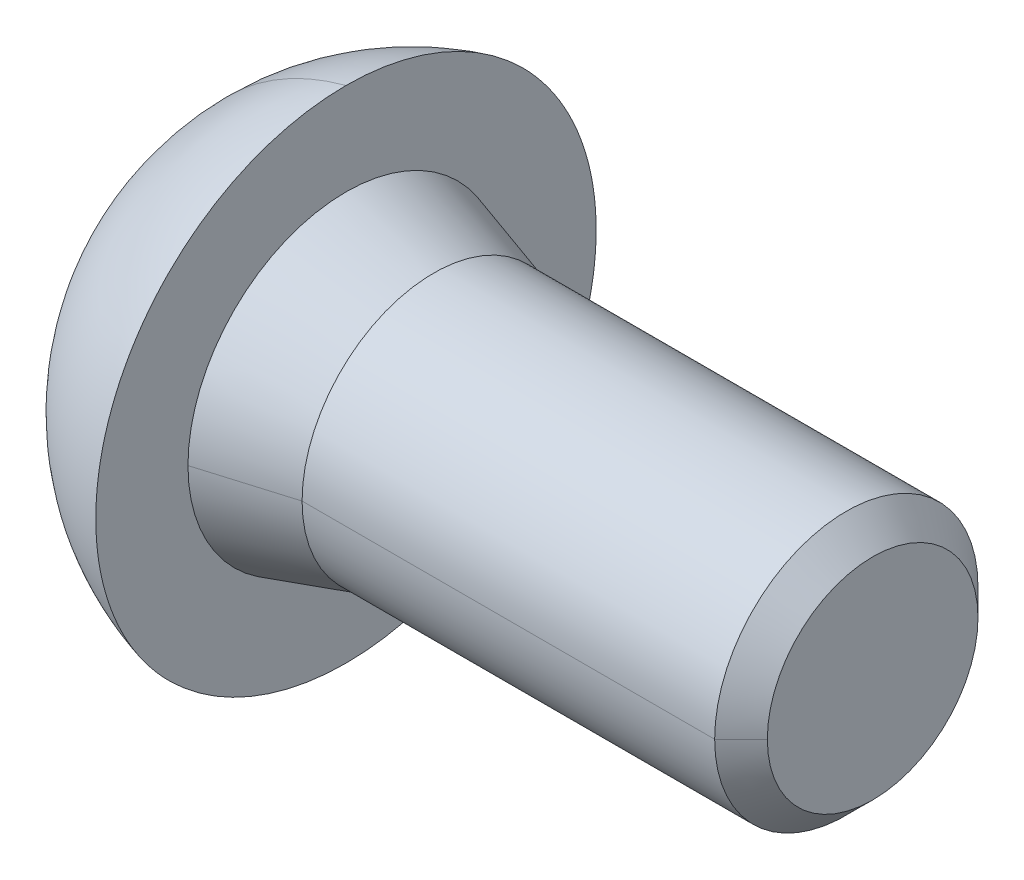
ISO-10303-21;
HEADER;
FILE_DESCRIPTION(('STEP AP214'),'2;1');
FILE_NAME('part.step','',(''),(''),'','','');
FILE_SCHEMA(('AUTOMOTIVE_DESIGN { 1 0 10303 214 1 1 1 1 }'));
ENDSEC;
DATA;
#1=APPLICATION_CONTEXT('core data for automotive mechanical design processes');
#2=APPLICATION_PROTOCOL_DEFINITION('international standard','automotive_design',2000,#1);
#3=PRODUCT_CONTEXT('',#1,'mechanical');
#4=PRODUCT('Part','Part','',(#3));
#5=PRODUCT_RELATED_PRODUCT_CATEGORY('part','',(#4));
#6=PRODUCT_DEFINITION_FORMATION('','',#4);
#7=PRODUCT_DEFINITION_CONTEXT('part definition',#1,'design');
#8=PRODUCT_DEFINITION('design','',#6,#7);
#9=PRODUCT_DEFINITION_SHAPE('','',#8);
#10=(LENGTH_UNIT() NAMED_UNIT(*) SI_UNIT(.MILLI.,.METRE.));
#11=(NAMED_UNIT(*) PLANE_ANGLE_UNIT() SI_UNIT($,.RADIAN.));
#12=(NAMED_UNIT(*) SI_UNIT($,.STERADIAN.) SOLID_ANGLE_UNIT());
#13=UNCERTAINTY_MEASURE_WITH_UNIT(LENGTH_MEASURE(1.E-05),#10,'distance_accuracy_value','');
#14=(GEOMETRIC_REPRESENTATION_CONTEXT(3) GLOBAL_UNCERTAINTY_ASSIGNED_CONTEXT((#13)) GLOBAL_UNIT_ASSIGNED_CONTEXT((#10,
#11,#12)) REPRESENTATION_CONTEXT('',''));
#15=CARTESIAN_POINT('',(0.,0.,0.));
#16=DIRECTION('',(0.,0.,1.));
#17=DIRECTION('',(1.,0.,0.));
#18=AXIS2_PLACEMENT_3D('',#15,#16,#17);
#19=CARTESIAN_POINT('',(-6.18082356026828,1.10400473277223,-0.637397429652666));
#20=DIRECTION('',(-0.979385865114737,0.174935689354957,-0.100999167339957));
#21=DIRECTION('',(-0.10258098021448,0.,0.994724656625258));
#22=AXIS2_PLACEMENT_3D('',#19,#20,#21);
#23=PLANE('',#22);
#24=DIRECTION('',(-0.175834818906266,-0.492209842562144,0.852532455303111));
#25=VECTOR('',#24,1.);
#26=CARTESIAN_POINT('',(-6.44375,0.,0.));
#27=LINE('',#26,#25);
#28=CARTESIAN_POINT('',(-6.44375,0.,0.));
#29=VERTEX_POINT('',#28);
#30=CARTESIAN_POINT('',(-6.65,-0.577350269189626,1.));
#31=VERTEX_POINT('',#30);
#32=EDGE_CURVE('E139',#29,#31,#27,.T.);
#33=ORIENTED_EDGE('',*,*,#32,.F.);
#34=DIRECTION('',(-0.175834818906266,-0.984419685124287,0.));
#35=VECTOR('',#34,1.);
#36=CARTESIAN_POINT('',(-6.44375,0.,0.));
#37=LINE('',#36,#35);
#38=CARTESIAN_POINT('',(-6.65,-1.15470053837925,0.));
#39=VERTEX_POINT('',#38);
#40=EDGE_CURVE('E10',#29,#39,#37,.T.);
#41=ORIENTED_EDGE('',*,*,#40,.T.);
#42=DIRECTION('',(0.,0.5,0.866025403784438));
#43=VECTOR('',#42,1.);
#44=CARTESIAN_POINT('',(-6.65,-0.577350269189626,1.));
#45=LINE('',#44,#43);
#46=EDGE_CURVE('E255',#39,#31,#45,.T.);
#47=ORIENTED_EDGE('',*,*,#46,.T.);
#48=EDGE_LOOP('',(#33,#41,#47));
#49=FACE_BOUND('',#48,.T.);
#50=ADVANCED_FACE('F16',(#49),#23,.T.);
#51=CARTESIAN_POINT('',(-6.18082356026828,1.10400473277223,0.637397429652665));
#52=DIRECTION('',(-0.979385865114737,0.174935689354957,0.100999167339957));
#53=DIRECTION('',(0.102580980214479,0.,0.994724656625258));
#54=AXIS2_PLACEMENT_3D('',#51,#52,#53);
#55=PLANE('',#54);
#56=ORIENTED_EDGE('',*,*,#40,.F.);
#57=DIRECTION('',(-0.175834818906266,-0.492209842562142,-0.852532455303112));
#58=VECTOR('',#57,1.);
#59=CARTESIAN_POINT('',(-6.44375,0.,0.));
#60=LINE('',#59,#58);
#61=CARTESIAN_POINT('',(-6.65,-0.577350269189625,-1.));
#62=VERTEX_POINT('',#61);
#63=EDGE_CURVE('E20',#29,#62,#60,.T.);
#64=ORIENTED_EDGE('',*,*,#63,.T.);
#65=DIRECTION('',(0.,-0.5,0.866025403784439));
#66=VECTOR('',#65,1.);
#67=CARTESIAN_POINT('',(-6.65,-1.15470053837925,0.));
#68=LINE('',#67,#66);
#69=EDGE_CURVE('E190',#62,#39,#68,.T.);
#70=ORIENTED_EDGE('',*,*,#69,.T.);
#71=EDGE_LOOP('',(#56,#64,#70));
#72=FACE_BOUND('',#71,.T.);
#73=ADVANCED_FACE('F337',(#72),#55,.T.);
#74=CARTESIAN_POINT('',(-6.18082356026828,0.,1.27479485930533));
#75=DIRECTION('',(-0.979385865114737,0.,0.201998334679914));
#76=DIRECTION('',(0.,1.,0.));
#77=AXIS2_PLACEMENT_3D('',#74,#75,#76);
#78=PLANE('',#77);
#79=ORIENTED_EDGE('',*,*,#63,.F.);
#80=DIRECTION('',(-0.175834818906266,0.492209842562143,-0.852532455303111));
#81=VECTOR('',#80,1.);
#82=CARTESIAN_POINT('',(-6.44375,0.,0.));
#83=LINE('',#82,#81);
#84=CARTESIAN_POINT('',(-6.65,0.577350269189626,-1.));
#85=VERTEX_POINT('',#84);
#86=EDGE_CURVE('E210',#29,#85,#83,.T.);
#87=ORIENTED_EDGE('',*,*,#86,.T.);
#88=DIRECTION('',(0.,-1.,0.));
#89=VECTOR('',#88,1.);
#90=CARTESIAN_POINT('',(-6.65,0.,-1.));
#91=LINE('',#90,#89);
#92=EDGE_CURVE('E189',#85,#62,#91,.T.);
#93=ORIENTED_EDGE('',*,*,#92,.T.);
#94=EDGE_LOOP('',(#79,#87,#93));
#95=FACE_BOUND('',#94,.T.);
#96=ADVANCED_FACE('F342',(#95),#78,.T.);
#97=CARTESIAN_POINT('',(-6.18082356026828,-1.10400473277222,0.637397429652666));
#98=DIRECTION('',(-0.979385865114737,-0.174935689354957,0.100999167339957));
#99=DIRECTION('',(-0.175834818906266,0.984419685124287,0.));
#100=AXIS2_PLACEMENT_3D('',#97,#98,#99);
#101=PLANE('',#100);
#102=ORIENTED_EDGE('',*,*,#86,.F.);
#103=DIRECTION('',(-0.175834818906266,0.984419685124287,0.));
#104=VECTOR('',#103,1.);
#105=CARTESIAN_POINT('',(-6.44375,0.,0.));
#106=LINE('',#105,#104);
#107=CARTESIAN_POINT('',(-6.65,1.15470053837925,0.));
#108=VERTEX_POINT('',#107);
#109=EDGE_CURVE('E140',#29,#108,#106,.T.);
#110=ORIENTED_EDGE('',*,*,#109,.T.);
#111=DIRECTION('',(0.,-0.5,-0.866025403784438));
#112=VECTOR('',#111,1.);
#113=CARTESIAN_POINT('',(-6.65,0.577350269189626,-1.));
#114=LINE('',#113,#112);
#115=EDGE_CURVE('E134',#108,#85,#114,.T.);
#116=ORIENTED_EDGE('',*,*,#115,.T.);
#117=EDGE_LOOP('',(#102,#110,#116));
#118=FACE_BOUND('',#117,.T.);
#119=ADVANCED_FACE('F368',(#118),#101,.T.);
#120=CARTESIAN_POINT('',(-6.18082356026828,0.,-1.27479485930533));
#121=DIRECTION('',(-0.979385865114737,0.,-0.201998334679914));
#122=DIRECTION('',(-0.201998334679914,0.,0.979385865114737));
#123=AXIS2_PLACEMENT_3D('',#120,#121,#122);
#124=PLANE('',#123);
#125=DIRECTION('',(-0.175834818906266,0.492209842562145,0.85253245530311));
#126=VECTOR('',#125,1.);
#127=CARTESIAN_POINT('',(-6.44375,0.,0.));
#128=LINE('',#127,#126);
#129=CARTESIAN_POINT('',(-6.65,0.577350269189627,1.));
#130=VERTEX_POINT('',#129);
#131=EDGE_CURVE('E136',#29,#130,#128,.T.);
#132=ORIENTED_EDGE('',*,*,#131,.F.);
#133=ORIENTED_EDGE('',*,*,#32,.T.);
#134=DIRECTION('',(0.,1.,0.));
#135=VECTOR('',#134,1.);
#136=CARTESIAN_POINT('',(-6.65,0.,1.));
#137=LINE('',#136,#135);
#138=EDGE_CURVE('E179',#31,#130,#137,.T.);
#139=ORIENTED_EDGE('',*,*,#138,.T.);
#140=EDGE_LOOP('',(#132,#133,#139));
#141=FACE_BOUND('',#140,.T.);
#142=ADVANCED_FACE('F247',(#141),#124,.T.);
#143=CARTESIAN_POINT('',(-6.18082356026828,-1.10400473277223,-0.637397429652665));
#144=DIRECTION('',(-0.979385865114737,-0.174935689354957,-0.100999167339957));
#145=DIRECTION('',(-0.175834818906266,0.984419685124287,0.));
#146=AXIS2_PLACEMENT_3D('',#143,#144,#145);
#147=PLANE('',#146);
#148=ORIENTED_EDGE('',*,*,#109,.F.);
#149=ORIENTED_EDGE('',*,*,#131,.T.);
#150=DIRECTION('',(0.,0.5,-0.866025403784439));
#151=VECTOR('',#150,1.);
#152=CARTESIAN_POINT('',(-6.65,1.15470053837925,0.));
#153=LINE('',#152,#151);
#154=EDGE_CURVE('E171',#130,#108,#153,.T.);
#155=ORIENTED_EDGE('',*,*,#154,.T.);
#156=EDGE_LOOP('',(#148,#149,#155));
#157=FACE_BOUND('',#156,.T.);
#158=ADVANCED_FACE('F275',(#157),#147,.T.);
#159=CARTESIAN_POINT('',(0.,0.,0.));
#160=DIRECTION('',(-1.,0.,0.));
#161=DIRECTION('',(0.,0.,1.));
#162=AXIS2_PLACEMENT_3D('',#159,#160,#161);
#163=CONICAL_SURFACE('',#162,1.2,0.785398163397445);
#164=DIRECTION('',(-0.70710678118655,0.,-0.707106781186545));
#165=VECTOR('',#164,1.);
#166=CARTESIAN_POINT('',(0.,0.,-1.2));
#167=LINE('',#166,#165);
#168=CARTESIAN_POINT('',(0.,0.,-1.2));
#169=VERTEX_POINT('',#168);
#170=CARTESIAN_POINT('',(-0.3,0.,-1.5));
#171=VERTEX_POINT('',#170);
#172=EDGE_CURVE('E116',#169,#171,#167,.T.);
#173=ORIENTED_EDGE('',*,*,#172,.F.);
#174=CARTESIAN_POINT('',(0.,0.,0.));
#175=DIRECTION('',(1.,0.,0.));
#176=DIRECTION('',(0.,0.,-1.));
#177=AXIS2_PLACEMENT_3D('',#174,#175,#176);
#178=CIRCLE('',#177,1.2);
#179=CARTESIAN_POINT('',(0.,0.,1.2));
#180=VERTEX_POINT('',#179);
#181=EDGE_CURVE('E103',#180,#169,#178,.T.);
#182=ORIENTED_EDGE('',*,*,#181,.F.);
#183=DIRECTION('',(-0.70710678118655,0.,0.707106781186545));
#184=VECTOR('',#183,1.);
#185=CARTESIAN_POINT('',(0.,0.,1.2));
#186=LINE('',#185,#184);
#187=CARTESIAN_POINT('',(-0.3,0.,1.5));
#188=VERTEX_POINT('',#187);
#189=EDGE_CURVE('E126',#180,#188,#186,.T.);
#190=ORIENTED_EDGE('',*,*,#189,.T.);
#191=CARTESIAN_POINT('',(-0.3,0.,0.));
#192=DIRECTION('',(-1.,0.,0.));
#193=DIRECTION('',(0.,0.,-1.));
#194=AXIS2_PLACEMENT_3D('',#191,#192,#193);
#195=CIRCLE('',#194,1.5);
#196=EDGE_CURVE('E118',#171,#188,#195,.T.);
#197=ORIENTED_EDGE('',*,*,#196,.F.);
#198=EDGE_LOOP('',(#173,#182,#190,#197));
#199=FACE_BOUND('',#198,.T.);
#200=ADVANCED_FACE('F18',(#199),#163,.T.);
#201=CARTESIAN_POINT('',(-6.65,1.15470053837925,0.));
#202=DIRECTION('',(0.,0.866025403784439,-0.5));
#203=DIRECTION('',(-1.,0.,0.));
#204=AXIS2_PLACEMENT_3D('',#201,#202,#203);
#205=PLANE('',#204);
#206=DIRECTION('',(0.,-0.5,-0.866025403784439));
#207=VECTOR('',#206,1.);
#208=CARTESIAN_POINT('',(-7.65,1.15470053837925,0.));
#209=LINE('',#208,#207);
#210=CARTESIAN_POINT('',(-7.65,1.15470053837925,0.));
#211=VERTEX_POINT('',#210);
#212=CARTESIAN_POINT('',(-7.65,0.577350269189626,-1.));
#213=VERTEX_POINT('',#212);
#214=EDGE_CURVE('E157',#211,#213,#209,.T.);
#215=ORIENTED_EDGE('',*,*,#214,.T.);
#216=DIRECTION('',(-1.,0.,0.));
#217=VECTOR('',#216,1.);
#218=CARTESIAN_POINT('',(-6.65,0.577350269189626,-1.));
#219=LINE('',#218,#217);
#220=EDGE_CURVE('E232',#85,#213,#219,.T.);
#221=ORIENTED_EDGE('',*,*,#220,.F.);
#222=ORIENTED_EDGE('',*,*,#115,.F.);
#223=DIRECTION('',(-1.,0.,0.));
#224=VECTOR('',#223,1.);
#225=CARTESIAN_POINT('',(-6.65,1.15470053837925,0.));
#226=LINE('',#225,#224);
#227=EDGE_CURVE('E176',#108,#211,#226,.T.);
#228=ORIENTED_EDGE('',*,*,#227,.T.);
#229=EDGE_LOOP('',(#215,#221,#222,#228));
#230=FACE_BOUND('',#229,.T.);
#231=ADVANCED_FACE('F354',(#230),#205,.F.);
#232=CARTESIAN_POINT('',(-6.65,0.577350269189626,-1.));
#233=DIRECTION('',(0.,0.,-1.));
#234=DIRECTION('',(0.,-1.,0.));
#235=AXIS2_PLACEMENT_3D('',#232,#233,#234);
#236=PLANE('',#235);
#237=DIRECTION('',(0.,-1.,0.));
#238=VECTOR('',#237,1.);
#239=CARTESIAN_POINT('',(-7.65,0.577350269189626,-1.));
#240=LINE('',#239,#238);
#241=CARTESIAN_POINT('',(-7.65,-0.577350269189627,-1.));
#242=VERTEX_POINT('',#241);
#243=EDGE_CURVE('E153',#213,#242,#240,.T.);
#244=ORIENTED_EDGE('',*,*,#243,.T.);
#245=DIRECTION('',(-1.,0.,0.));
#246=VECTOR('',#245,1.);
#247=CARTESIAN_POINT('',(-6.65,-0.577350269189627,-1.));
#248=LINE('',#247,#246);
#249=EDGE_CURVE('E185',#62,#242,#248,.T.);
#250=ORIENTED_EDGE('',*,*,#249,.F.);
#251=ORIENTED_EDGE('',*,*,#92,.F.);
#252=ORIENTED_EDGE('',*,*,#220,.T.);
#253=EDGE_LOOP('',(#244,#250,#251,#252));
#254=FACE_BOUND('',#253,.T.);
#255=ADVANCED_FACE('F350',(#254),#236,.F.);
#256=CARTESIAN_POINT('',(-6.65,-0.577350269189627,-1.));
#257=DIRECTION('',(0.,-0.866025403784439,-0.5));
#258=DIRECTION('',(0.,0.5,-0.866025403784439));
#259=AXIS2_PLACEMENT_3D('',#256,#257,#258);
#260=PLANE('',#259);
#261=DIRECTION('',(0.,-0.5,0.866025403784439));
#262=VECTOR('',#261,1.);
#263=CARTESIAN_POINT('',(-7.65,-0.577350269189627,-1.));
#264=LINE('',#263,#262);
#265=CARTESIAN_POINT('',(-7.65,-1.15470053837925,0.));
#266=VERTEX_POINT('',#265);
#267=EDGE_CURVE('E158',#242,#266,#264,.T.);
#268=ORIENTED_EDGE('',*,*,#267,.T.);
#269=DIRECTION('',(-1.,0.,0.));
#270=VECTOR('',#269,1.);
#271=CARTESIAN_POINT('',(-6.65,-1.15470053837925,0.));
#272=LINE('',#271,#270);
#273=EDGE_CURVE('E224',#39,#266,#272,.T.);
#274=ORIENTED_EDGE('',*,*,#273,.F.);
#275=ORIENTED_EDGE('',*,*,#69,.F.);
#276=ORIENTED_EDGE('',*,*,#249,.T.);
#277=EDGE_LOOP('',(#268,#274,#275,#276));
#278=FACE_BOUND('',#277,.T.);
#279=ADVANCED_FACE('F353',(#278),#260,.F.);
#280=CARTESIAN_POINT('',(-6.65,-1.15470053837925,0.));
#281=DIRECTION('',(0.,-0.866025403784439,0.5));
#282=DIRECTION('',(-1.,0.,0.));
#283=AXIS2_PLACEMENT_3D('',#280,#281,#282);
#284=PLANE('',#283);
#285=DIRECTION('',(0.,0.5,0.866025403784439));
#286=VECTOR('',#285,1.);
#287=CARTESIAN_POINT('',(-7.65,-1.15470053837925,0.));
#288=LINE('',#287,#286);
#289=CARTESIAN_POINT('',(-7.65,-0.577350269189627,1.));
#290=VERTEX_POINT('',#289);
#291=EDGE_CURVE('E145',#266,#290,#288,.T.);
#292=ORIENTED_EDGE('',*,*,#291,.T.);
#293=DIRECTION('',(-1.,0.,0.));
#294=VECTOR('',#293,1.);
#295=CARTESIAN_POINT('',(-6.65,-0.577350269189627,1.));
#296=LINE('',#295,#294);
#297=EDGE_CURVE('E206',#31,#290,#296,.T.);
#298=ORIENTED_EDGE('',*,*,#297,.F.);
#299=ORIENTED_EDGE('',*,*,#46,.F.);
#300=ORIENTED_EDGE('',*,*,#273,.T.);
#301=EDGE_LOOP('',(#292,#298,#299,#300));
#302=FACE_BOUND('',#301,.T.);
#303=ADVANCED_FACE('F261',(#302),#284,.F.);
#304=CARTESIAN_POINT('',(-6.65,-0.577350269189627,1.));
#305=DIRECTION('',(0.,0.,1.));
#306=DIRECTION('',(0.,-1.,0.));
#307=AXIS2_PLACEMENT_3D('',#304,#305,#306);
#308=PLANE('',#307);
#309=DIRECTION('',(0.,1.,0.));
#310=VECTOR('',#309,1.);
#311=CARTESIAN_POINT('',(-7.65,-0.577350269189627,1.));
#312=LINE('',#311,#310);
#313=CARTESIAN_POINT('',(-7.65,0.577350269189627,1.));
#314=VERTEX_POINT('',#313);
#315=EDGE_CURVE('E141',#290,#314,#312,.T.);
#316=ORIENTED_EDGE('',*,*,#315,.T.);
#317=DIRECTION('',(-1.,0.,0.));
#318=VECTOR('',#317,1.);
#319=CARTESIAN_POINT('',(-6.65,0.577350269189627,1.));
#320=LINE('',#319,#318);
#321=EDGE_CURVE('E175',#130,#314,#320,.T.);
#322=ORIENTED_EDGE('',*,*,#321,.F.);
#323=ORIENTED_EDGE('',*,*,#138,.F.);
#324=ORIENTED_EDGE('',*,*,#297,.T.);
#325=EDGE_LOOP('',(#316,#322,#323,#324));
#326=FACE_BOUND('',#325,.T.);
#327=ADVANCED_FACE('F267',(#326),#308,.F.);
#328=CARTESIAN_POINT('',(-6.65,0.577350269189627,1.));
#329=DIRECTION('',(0.,0.866025403784439,0.5));
#330=DIRECTION('',(1.,0.,0.));
#331=AXIS2_PLACEMENT_3D('',#328,#329,#330);
#332=PLANE('',#331);
#333=DIRECTION('',(0.,0.5,-0.866025403784439));
#334=VECTOR('',#333,1.);
#335=CARTESIAN_POINT('',(-7.65,0.577350269189627,1.));
#336=LINE('',#335,#334);
#337=EDGE_CURVE('E146',#314,#211,#336,.T.);
#338=ORIENTED_EDGE('',*,*,#337,.T.);
#339=ORIENTED_EDGE('',*,*,#227,.F.);
#340=ORIENTED_EDGE('',*,*,#154,.F.);
#341=ORIENTED_EDGE('',*,*,#321,.T.);
#342=EDGE_LOOP('',(#338,#339,#340,#341));
#343=FACE_BOUND('',#342,.T.);
#344=ADVANCED_FACE('F273',(#343),#332,.F.);
#345=CARTESIAN_POINT('',(-7.65,1.71,0.));
#346=DIRECTION('',(-1.,0.,0.));
#347=DIRECTION('',(0.,0.,1.));
#348=AXIS2_PLACEMENT_3D('',#345,#346,#347);
#349=PLANE('',#348);
#350=ORIENTED_EDGE('',*,*,#337,.F.);
#351=ORIENTED_EDGE('',*,*,#315,.F.);
#352=ORIENTED_EDGE('',*,*,#291,.F.);
#353=ORIENTED_EDGE('',*,*,#267,.F.);
#354=ORIENTED_EDGE('',*,*,#243,.F.);
#355=ORIENTED_EDGE('',*,*,#214,.F.);
#356=EDGE_LOOP('',(#350,#351,#352,#353,#354,#355));
#357=FACE_BOUND('',#356,.T.);
#358=CARTESIAN_POINT('',(-7.65,0.,0.));
#359=DIRECTION('',(1.,0.,0.));
#360=DIRECTION('',(0.,0.,-1.));
#361=AXIS2_PLACEMENT_3D('',#358,#359,#360);
#362=CIRCLE('',#361,1.71);
#363=CARTESIAN_POINT('',(-7.65,1.71,0.));
#364=VERTEX_POINT('',#363);
#365=CARTESIAN_POINT('',(-7.65,-1.71,0.));
#366=VERTEX_POINT('',#365);
#367=EDGE_CURVE('E170',#364,#366,#362,.T.);
#368=ORIENTED_EDGE('',*,*,#367,.F.);
#369=CARTESIAN_POINT('',(-7.65,0.,0.));
#370=DIRECTION('',(1.,0.,0.));
#371=DIRECTION('',(0.,0.,-1.));
#372=AXIS2_PLACEMENT_3D('',#369,#370,#371);
#373=CIRCLE('',#372,1.71);
#374=EDGE_CURVE('E151',#366,#364,#373,.T.);
#375=ORIENTED_EDGE('',*,*,#374,.F.);
#376=EDGE_LOOP('',(#368,#375));
#377=FACE_BOUND('',#376,.T.);
#378=ADVANCED_FACE('F346',(#357,#377),#349,.T.);
#379=CARTESIAN_POINT('',(-5.24972727272728,0.,0.));
#380=DIRECTION('',(0.,0.,1.));
#381=DIRECTION('',(0.,1.,0.));
#382=AXIS2_PLACEMENT_3D('',#379,#380,#381);
#383=SPHERICAL_SURFACE('',#382,2.94710182472361);
#384=CARTESIAN_POINT('',(-5.24972727272728,0.,0.));
#385=DIRECTION('',(0.,0.,1.));
#386=DIRECTION('',(0.,-1.,0.));
#387=AXIS2_PLACEMENT_3D('',#384,#385,#386);
#388=CIRCLE('',#387,2.94710182472361);
#389=CARTESIAN_POINT('',(-6.,-2.85,0.));
#390=VERTEX_POINT('',#389);
#391=EDGE_CURVE('E180',#366,#390,#388,.T.);
#392=ORIENTED_EDGE('',*,*,#391,.F.);
#393=ORIENTED_EDGE('',*,*,#374,.T.);
#394=CARTESIAN_POINT('',(-5.24972727272728,0.,0.));
#395=DIRECTION('',(0.,0.,-1.));
#396=DIRECTION('',(-1.,0.,0.));
#397=AXIS2_PLACEMENT_3D('',#394,#395,#396);
#398=CIRCLE('',#397,2.94710182472361);
#399=CARTESIAN_POINT('',(-6.,2.85,0.));
#400=VERTEX_POINT('',#399);
#401=EDGE_CURVE('E167',#364,#400,#398,.T.);
#402=ORIENTED_EDGE('',*,*,#401,.T.);
#403=CARTESIAN_POINT('',(-6.,0.,0.));
#404=DIRECTION('',(1.,0.,0.));
#405=DIRECTION('',(0.,0.,-1.));
#406=AXIS2_PLACEMENT_3D('',#403,#404,#405);
#407=CIRCLE('',#406,2.85);
#408=EDGE_CURVE('E147',#390,#400,#407,.T.);
#409=ORIENTED_EDGE('',*,*,#408,.F.);
#410=EDGE_LOOP('',(#392,#393,#402,#409));
#411=FACE_BOUND('',#410,.T.);
#412=ADVANCED_FACE('F359',(#411),#383,.T.);
#413=CARTESIAN_POINT('',(-6.,1.8,0.));
#414=DIRECTION('',(1.,0.,0.));
#415=DIRECTION('',(0.,1.,0.));
#416=AXIS2_PLACEMENT_3D('',#413,#414,#415);
#417=PLANE('',#416);
#418=CARTESIAN_POINT('',(-6.,0.,0.));
#419=DIRECTION('',(1.,0.,0.));
#420=DIRECTION('',(0.,0.,-1.));
#421=AXIS2_PLACEMENT_3D('',#418,#419,#420);
#422=CIRCLE('',#421,1.8);
#423=CARTESIAN_POINT('',(-6.,0.,1.8));
#424=VERTEX_POINT('',#423);
#425=CARTESIAN_POINT('',(-6.,0.,-1.8));
#426=VERTEX_POINT('',#425);
#427=EDGE_CURVE('E152',#424,#426,#422,.T.);
#428=ORIENTED_EDGE('',*,*,#427,.F.);
#429=CARTESIAN_POINT('',(-6.,0.,0.));
#430=DIRECTION('',(1.,0.,0.));
#431=DIRECTION('',(0.,0.,-1.));
#432=AXIS2_PLACEMENT_3D('',#429,#430,#431);
#433=CIRCLE('',#432,1.8);
#434=EDGE_CURVE('E199',#426,#424,#433,.T.);
#435=ORIENTED_EDGE('',*,*,#434,.F.);
#436=EDGE_LOOP('',(#428,#435));
#437=FACE_BOUND('',#436,.T.);
#438=CARTESIAN_POINT('',(-6.,0.,0.));
#439=DIRECTION('',(1.,0.,0.));
#440=DIRECTION('',(0.,0.,-1.));
#441=AXIS2_PLACEMENT_3D('',#438,#439,#440);
#442=CIRCLE('',#441,2.85);
#443=EDGE_CURVE('E184',#400,#390,#442,.T.);
#444=ORIENTED_EDGE('',*,*,#443,.T.);
#445=ORIENTED_EDGE('',*,*,#408,.T.);
#446=EDGE_LOOP('',(#444,#445));
#447=FACE_BOUND('',#446,.T.);
#448=ADVANCED_FACE('F356',(#437,#447),#417,.T.);
#449=CARTESIAN_POINT('',(-5.,0.,0.));
#450=DIRECTION('',(-1.,0.,0.));
#451=DIRECTION('',(0.,0.,1.));
#452=AXIS2_PLACEMENT_3D('',#449,#450,#451);
#453=CONICAL_SURFACE('',#452,1.5,0.291456794477868);
#454=DIRECTION('',(-0.957826285221151,0.,-0.287347885566346));
#455=VECTOR('',#454,1.);
#456=CARTESIAN_POINT('',(-5.,0.,-1.5));
#457=LINE('',#456,#455);
#458=CARTESIAN_POINT('',(-5.,0.,-1.5));
#459=VERTEX_POINT('',#458);
#460=EDGE_CURVE('E166',#459,#426,#457,.T.);
#461=ORIENTED_EDGE('',*,*,#460,.F.);
#462=CARTESIAN_POINT('',(-5.,0.,0.));
#463=DIRECTION('',(1.,0.,0.));
#464=DIRECTION('',(0.,0.,-1.));
#465=AXIS2_PLACEMENT_3D('',#462,#463,#464);
#466=CIRCLE('',#465,1.5);
#467=CARTESIAN_POINT('',(-5.,0.,1.5));
#468=VERTEX_POINT('',#467);
#469=EDGE_CURVE('E112',#468,#459,#466,.T.);
#470=ORIENTED_EDGE('',*,*,#469,.F.);
#471=DIRECTION('',(-0.957826285221151,0.,0.287347885566346));
#472=VECTOR('',#471,1.);
#473=CARTESIAN_POINT('',(-5.,0.,1.5));
#474=LINE('',#473,#472);
#475=EDGE_CURVE('E194',#468,#424,#474,.T.);
#476=ORIENTED_EDGE('',*,*,#475,.T.);
#477=ORIENTED_EDGE('',*,*,#427,.T.);
#478=EDGE_LOOP('',(#461,#470,#476,#477));
#479=FACE_BOUND('',#478,.T.);
#480=ADVANCED_FACE('F313',(#479),#453,.T.);
#481=CARTESIAN_POINT('',(0.,0.,0.));
#482=DIRECTION('',(1.,0.,0.));
#483=DIRECTION('',(0.,0.,-1.));
#484=AXIS2_PLACEMENT_3D('',#481,#482,#483);
#485=CYLINDRICAL_SURFACE('',#484,1.5);
#486=DIRECTION('',(1.,0.,0.));
#487=VECTOR('',#486,1.);
#488=CARTESIAN_POINT('',(0.,0.,1.5));
#489=LINE('',#488,#487);
#490=EDGE_CURVE('E198',#468,#188,#489,.T.);
#491=ORIENTED_EDGE('',*,*,#490,.F.);
#492=ORIENTED_EDGE('',*,*,#469,.T.);
#493=DIRECTION('',(1.,0.,0.));
#494=VECTOR('',#493,1.);
#495=CARTESIAN_POINT('',(0.,0.,-1.5));
#496=LINE('',#495,#494);
#497=EDGE_CURVE('E113',#459,#171,#496,.T.);
#498=ORIENTED_EDGE('',*,*,#497,.T.);
#499=ORIENTED_EDGE('',*,*,#196,.T.);
#500=EDGE_LOOP('',(#491,#492,#498,#499));
#501=FACE_BOUND('',#500,.T.);
#502=ADVANCED_FACE('F319',(#501),#485,.T.);
#503=CARTESIAN_POINT('',(0.,0.,0.));
#504=DIRECTION('',(1.,0.,0.));
#505=DIRECTION('',(0.,1.,0.));
#506=AXIS2_PLACEMENT_3D('',#503,#504,#505);
#507=PLANE('',#506);
#508=ORIENTED_EDGE('',*,*,#181,.T.);
#509=CARTESIAN_POINT('',(0.,0.,0.));
#510=DIRECTION('',(1.,0.,0.));
#511=DIRECTION('',(0.,0.,-1.));
#512=AXIS2_PLACEMENT_3D('',#509,#510,#511);
#513=CIRCLE('',#512,1.2);
#514=EDGE_CURVE('E107',#169,#180,#513,.T.);
#515=ORIENTED_EDGE('',*,*,#514,.T.);
#516=EDGE_LOOP('',(#508,#515));
#517=FACE_BOUND('',#516,.T.);
#518=ADVANCED_FACE('F105',(#517),#507,.T.);
#519=CARTESIAN_POINT('',(0.,0.,0.));
#520=DIRECTION('',(1.,0.,0.));
#521=DIRECTION('',(0.,0.,-1.));
#522=AXIS2_PLACEMENT_3D('',#519,#520,#521);
#523=CYLINDRICAL_SURFACE('',#522,1.5);
#524=CARTESIAN_POINT('',(-5.,0.,0.));
#525=DIRECTION('',(1.,0.,0.));
#526=DIRECTION('',(0.,0.,-1.));
#527=AXIS2_PLACEMENT_3D('',#524,#525,#526);
#528=CIRCLE('',#527,1.5);
#529=EDGE_CURVE('E162',#459,#468,#528,.T.);
#530=ORIENTED_EDGE('',*,*,#529,.T.);
#531=ORIENTED_EDGE('',*,*,#490,.T.);
#532=CARTESIAN_POINT('',(-0.3,0.,0.));
#533=DIRECTION('',(-1.,0.,0.));
#534=DIRECTION('',(0.,0.,-1.));
#535=AXIS2_PLACEMENT_3D('',#532,#533,#534);
#536=CIRCLE('',#535,1.5);
#537=EDGE_CURVE('E123',#188,#171,#536,.T.);
#538=ORIENTED_EDGE('',*,*,#537,.T.);
#539=ORIENTED_EDGE('',*,*,#497,.F.);
#540=EDGE_LOOP('',(#530,#531,#538,#539));
#541=FACE_BOUND('',#540,.T.);
#542=ADVANCED_FACE('F323',(#541),#523,.T.);
#543=CARTESIAN_POINT('',(-5.,0.,0.));
#544=DIRECTION('',(-1.,0.,0.));
#545=DIRECTION('',(0.,0.,1.));
#546=AXIS2_PLACEMENT_3D('',#543,#544,#545);
#547=CONICAL_SURFACE('',#546,1.5,0.291456794477868);
#548=ORIENTED_EDGE('',*,*,#529,.F.);
#549=ORIENTED_EDGE('',*,*,#460,.T.);
#550=ORIENTED_EDGE('',*,*,#434,.T.);
#551=ORIENTED_EDGE('',*,*,#475,.F.);
#552=EDGE_LOOP('',(#548,#549,#550,#551));
#553=FACE_BOUND('',#552,.T.);
#554=ADVANCED_FACE('F322',(#553),#547,.T.);
#555=CARTESIAN_POINT('',(-5.24972727272728,0.,0.));
#556=DIRECTION('',(0.,0.,1.));
#557=DIRECTION('',(0.,1.,0.));
#558=AXIS2_PLACEMENT_3D('',#555,#556,#557);
#559=SPHERICAL_SURFACE('',#558,2.94710182472361);
#560=ORIENTED_EDGE('',*,*,#367,.T.);
#561=ORIENTED_EDGE('',*,*,#391,.T.);
#562=ORIENTED_EDGE('',*,*,#443,.F.);
#563=ORIENTED_EDGE('',*,*,#401,.F.);
#564=EDGE_LOOP('',(#560,#561,#562,#563));
#565=FACE_BOUND('',#564,.T.);
#566=ADVANCED_FACE('F331',(#565),#559,.T.);
#567=CARTESIAN_POINT('',(0.,0.,0.));
#568=DIRECTION('',(-1.,0.,0.));
#569=DIRECTION('',(0.,0.,1.));
#570=AXIS2_PLACEMENT_3D('',#567,#568,#569);
#571=CONICAL_SURFACE('',#570,1.2,0.785398163397445);
#572=ORIENTED_EDGE('',*,*,#514,.F.);
#573=ORIENTED_EDGE('',*,*,#172,.T.);
#574=ORIENTED_EDGE('',*,*,#537,.F.);
#575=ORIENTED_EDGE('',*,*,#189,.F.);
#576=EDGE_LOOP('',(#572,#573,#574,#575));
#577=FACE_BOUND('',#576,.T.);
#578=ADVANCED_FACE('F125',(#577),#571,.T.);
#579=CLOSED_SHELL('',(#50,#73,#96,#119,#142,#158,#200,#231,#255,#279,#303,#327,#344,#378,#412,
#448,#480,#502,#518,#542,#554,#566,#578));
#580=MANIFOLD_SOLID_BREP('B1',#579);
#581=ADVANCED_BREP_SHAPE_REPRESENTATION('',(#18,#580),#14);
#582=SHAPE_DEFINITION_REPRESENTATION(#9,#581);
ENDSEC;
END-ISO-10303-21;
